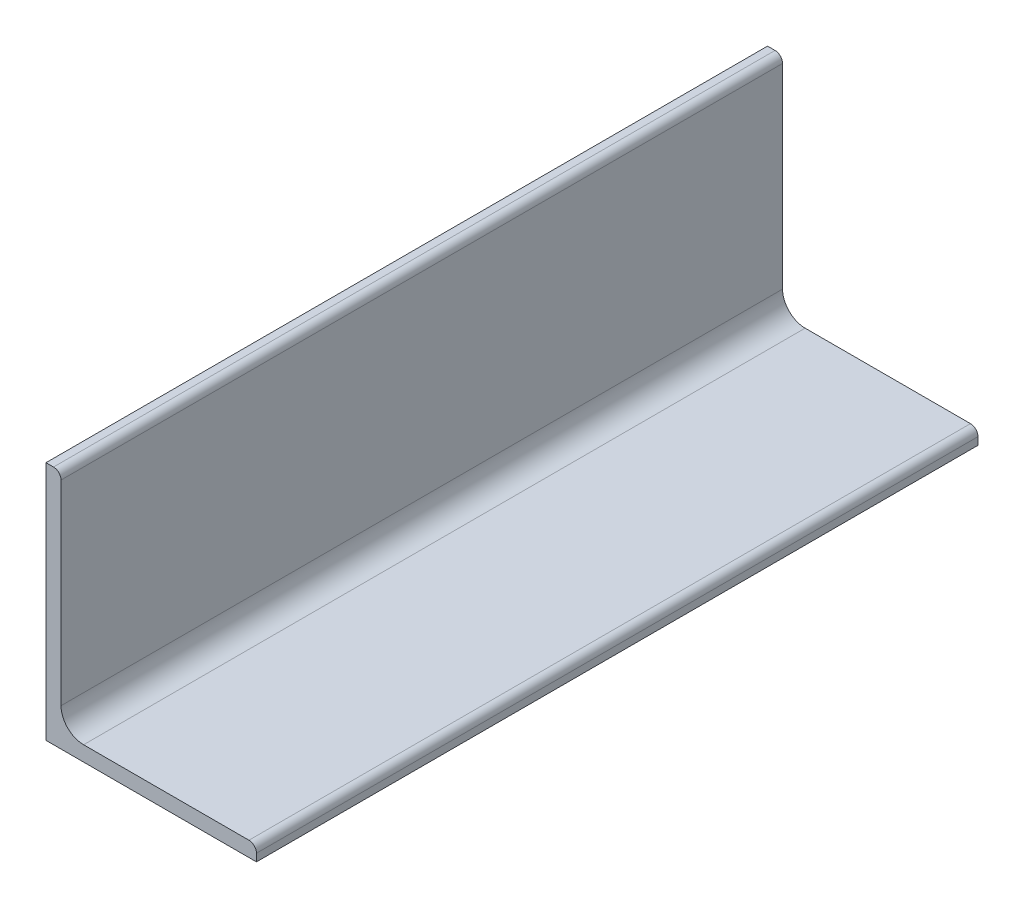
ISO-10303-21;
HEADER;
FILE_DESCRIPTION(('STEP AP214'),'2;1');
FILE_NAME('part.step','',(''),(''),'','','');
FILE_SCHEMA(('AUTOMOTIVE_DESIGN { 1 0 10303 214 1 1 1 1 }'));
ENDSEC;
DATA;
#1=APPLICATION_CONTEXT('core data for automotive mechanical design processes');
#2=APPLICATION_PROTOCOL_DEFINITION('international standard','automotive_design',2000,#1);
#3=PRODUCT_CONTEXT('',#1,'mechanical');
#4=PRODUCT('Part','Part','',(#3));
#5=PRODUCT_RELATED_PRODUCT_CATEGORY('part','',(#4));
#6=PRODUCT_DEFINITION_FORMATION('','',#4);
#7=PRODUCT_DEFINITION_CONTEXT('part definition',#1,'design');
#8=PRODUCT_DEFINITION('design','',#6,#7);
#9=PRODUCT_DEFINITION_SHAPE('','',#8);
#10=(LENGTH_UNIT() NAMED_UNIT(*) SI_UNIT(.MILLI.,.METRE.));
#11=(NAMED_UNIT(*) PLANE_ANGLE_UNIT() SI_UNIT($,.RADIAN.));
#12=(NAMED_UNIT(*) SI_UNIT($,.STERADIAN.) SOLID_ANGLE_UNIT());
#13=UNCERTAINTY_MEASURE_WITH_UNIT(LENGTH_MEASURE(1.E-05),#10,'distance_accuracy_value','');
#14=(GEOMETRIC_REPRESENTATION_CONTEXT(3) GLOBAL_UNCERTAINTY_ASSIGNED_CONTEXT((#13)) GLOBAL_UNIT_ASSIGNED_CONTEXT((#10,
#11,#12)) REPRESENTATION_CONTEXT('',''));
#15=CARTESIAN_POINT('',(0.,0.,0.));
#16=DIRECTION('',(0.,0.,1.));
#17=DIRECTION('',(1.,0.,0.));
#18=AXIS2_PLACEMENT_3D('',#15,#16,#17);
#19=CARTESIAN_POINT('',(0.0836264027816469,102.172018782971,304.8));
#20=DIRECTION('',(1.,0.,0.));
#21=DIRECTION('',(0.,0.,-1.));
#22=AXIS2_PLACEMENT_3D('',#19,#20,#21);
#23=PLANE('',#22);
#24=DIRECTION('',(0.,-1.,0.));
#25=VECTOR('',#24,1.);
#26=CARTESIAN_POINT('',(0.0836264027816469,102.172018782971,0.));
#27=LINE('',#26,#25);
#28=CARTESIAN_POINT('',(0.0836264027816469,102.172018782971,0.));
#29=VERTEX_POINT('',#28);
#30=CARTESIAN_POINT('',(0.0836264027816469,0.572018782971054,0.));
#31=VERTEX_POINT('',#30);
#32=EDGE_CURVE('E135',#29,#31,#27,.T.);
#33=ORIENTED_EDGE('',*,*,#32,.T.);
#34=DIRECTION('',(0.,0.,-1.));
#35=VECTOR('',#34,1.);
#36=CARTESIAN_POINT('',(0.0836264027816469,0.572018782971054,304.8));
#37=LINE('',#36,#35);
#38=CARTESIAN_POINT('',(0.0836264027816469,0.572018782971054,304.8));
#39=VERTEX_POINT('',#38);
#40=EDGE_CURVE('E11',#39,#31,#37,.T.);
#41=ORIENTED_EDGE('',*,*,#40,.F.);
#42=DIRECTION('',(0.,-1.,0.));
#43=VECTOR('',#42,1.);
#44=CARTESIAN_POINT('',(0.0836264027816469,102.172018782971,304.8));
#45=LINE('',#44,#43);
#46=CARTESIAN_POINT('',(0.0836264027816469,102.172018782971,304.8));
#47=VERTEX_POINT('',#46);
#48=EDGE_CURVE('E151',#47,#39,#45,.T.);
#49=ORIENTED_EDGE('',*,*,#48,.F.);
#50=DIRECTION('',(0.,0.,-1.));
#51=VECTOR('',#50,1.);
#52=CARTESIAN_POINT('',(0.0836264027816469,102.172018782971,304.8));
#53=LINE('',#52,#51);
#54=EDGE_CURVE('E131',#47,#29,#53,.T.);
#55=ORIENTED_EDGE('',*,*,#54,.T.);
#56=EDGE_LOOP('',(#33,#41,#49,#55));
#57=FACE_BOUND('',#56,.T.);
#58=ADVANCED_FACE('F33',(#57),#23,.F.);
#59=CARTESIAN_POINT('',(0.0836264027816469,0.572018782971054,304.8));
#60=DIRECTION('',(0.,1.,0.));
#61=DIRECTION('',(0.,0.,1.));
#62=AXIS2_PLACEMENT_3D('',#59,#60,#61);
#63=PLANE('',#62);
#64=DIRECTION('',(1.,0.,0.));
#65=VECTOR('',#64,1.);
#66=CARTESIAN_POINT('',(0.0836264027816469,0.572018782971054,0.));
#67=LINE('',#66,#65);
#68=CARTESIAN_POINT('',(88.9836264027817,0.572018782971054,0.));
#69=VERTEX_POINT('',#68);
#70=EDGE_CURVE('E138',#31,#69,#67,.T.);
#71=ORIENTED_EDGE('',*,*,#70,.T.);
#72=DIRECTION('',(0.,0.,-1.));
#73=VECTOR('',#72,1.);
#74=CARTESIAN_POINT('',(88.9836264027817,0.572018782971054,304.8));
#75=LINE('',#74,#73);
#76=CARTESIAN_POINT('',(88.9836264027817,0.572018782971054,304.8));
#77=VERTEX_POINT('',#76);
#78=EDGE_CURVE('E41',#77,#69,#75,.T.);
#79=ORIENTED_EDGE('',*,*,#78,.F.);
#80=DIRECTION('',(1.,0.,0.));
#81=VECTOR('',#80,1.);
#82=CARTESIAN_POINT('',(0.0836264027816469,0.572018782971054,304.8));
#83=LINE('',#82,#81);
#84=EDGE_CURVE('E95',#39,#77,#83,.T.);
#85=ORIENTED_EDGE('',*,*,#84,.F.);
#86=ORIENTED_EDGE('',*,*,#40,.T.);
#87=EDGE_LOOP('',(#71,#79,#85,#86));
#88=FACE_BOUND('',#87,.T.);
#89=ADVANCED_FACE('F194',(#88),#63,.F.);
#90=CARTESIAN_POINT('',(88.9836264027817,0.572018782971054,304.8));
#91=DIRECTION('',(-1.,0.,0.));
#92=DIRECTION('',(0.,0.,1.));
#93=AXIS2_PLACEMENT_3D('',#90,#91,#92);
#94=PLANE('',#93);
#95=DIRECTION('',(0.,1.,0.));
#96=VECTOR('',#95,1.);
#97=CARTESIAN_POINT('',(88.9836264027817,0.572018782971054,0.));
#98=LINE('',#97,#96);
#99=CARTESIAN_POINT('',(88.9836264027817,3.74701878297105,0.));
#100=VERTEX_POINT('',#99);
#101=EDGE_CURVE('E140',#69,#100,#98,.T.);
#102=ORIENTED_EDGE('',*,*,#101,.T.);
#103=DIRECTION('',(0.,0.,-1.));
#104=VECTOR('',#103,1.);
#105=CARTESIAN_POINT('',(88.9836264027817,3.74701878297105,304.8));
#106=LINE('',#105,#104);
#107=CARTESIAN_POINT('',(88.9836264027817,3.74701878297105,304.8));
#108=VERTEX_POINT('',#107);
#109=EDGE_CURVE('E161',#108,#100,#106,.T.);
#110=ORIENTED_EDGE('',*,*,#109,.F.);
#111=DIRECTION('',(0.,1.,0.));
#112=VECTOR('',#111,1.);
#113=CARTESIAN_POINT('',(88.9836264027817,0.572018782971054,304.8));
#114=LINE('',#113,#112);
#115=EDGE_CURVE('E169',#77,#108,#114,.T.);
#116=ORIENTED_EDGE('',*,*,#115,.F.);
#117=ORIENTED_EDGE('',*,*,#78,.T.);
#118=EDGE_LOOP('',(#102,#110,#116,#117));
#119=FACE_BOUND('',#118,.T.);
#120=ADVANCED_FACE('F167',(#119),#94,.F.);
#121=CARTESIAN_POINT('',(85.8086264027816,3.74701878297105,304.8));
#122=DIRECTION('',(0.,0.,-1.));
#123=DIRECTION('',(-1.,0.,0.));
#124=AXIS2_PLACEMENT_3D('',#121,#122,#123);
#125=CYLINDRICAL_SURFACE('',#124,3.17500000000001);
#126=CARTESIAN_POINT('',(85.8086264027816,3.74701878297105,0.));
#127=DIRECTION('',(0.,0.,1.));
#128=DIRECTION('',(1.,0.,0.));
#129=AXIS2_PLACEMENT_3D('',#126,#127,#128);
#130=CIRCLE('',#129,3.17500000000001);
#131=CARTESIAN_POINT('',(85.8086264027816,6.92201878297106,0.));
#132=VERTEX_POINT('',#131);
#133=EDGE_CURVE('E142',#100,#132,#130,.T.);
#134=ORIENTED_EDGE('',*,*,#133,.T.);
#135=DIRECTION('',(0.,0.,-1.));
#136=VECTOR('',#135,1.);
#137=CARTESIAN_POINT('',(85.8086264027816,6.92201878297106,304.8));
#138=LINE('',#137,#136);
#139=CARTESIAN_POINT('',(85.8086264027816,6.92201878297106,304.8));
#140=VERTEX_POINT('',#139);
#141=EDGE_CURVE('E158',#140,#132,#138,.T.);
#142=ORIENTED_EDGE('',*,*,#141,.F.);
#143=CARTESIAN_POINT('',(85.8086264027816,3.74701878297105,304.8));
#144=DIRECTION('',(0.,0.,1.));
#145=DIRECTION('',(1.,0.,0.));
#146=AXIS2_PLACEMENT_3D('',#143,#144,#145);
#147=CIRCLE('',#146,3.17500000000001);
#148=EDGE_CURVE('E185',#108,#140,#147,.T.);
#149=ORIENTED_EDGE('',*,*,#148,.F.);
#150=ORIENTED_EDGE('',*,*,#109,.T.);
#151=EDGE_LOOP('',(#134,#142,#149,#150));
#152=FACE_BOUND('',#151,.T.);
#153=ADVANCED_FACE('F178',(#152),#125,.T.);
#154=CARTESIAN_POINT('',(85.8086264027816,6.92201878297105,304.8));
#155=DIRECTION('',(0.,-1.,0.));
#156=DIRECTION('',(0.,0.,-1.));
#157=AXIS2_PLACEMENT_3D('',#154,#155,#156);
#158=PLANE('',#157);
#159=DIRECTION('',(-1.,0.,0.));
#160=VECTOR('',#159,1.);
#161=CARTESIAN_POINT('',(85.8086264027816,6.92201878297105,0.));
#162=LINE('',#161,#160);
#163=CARTESIAN_POINT('',(15.9586264027816,6.92201878297105,0.));
#164=VERTEX_POINT('',#163);
#165=EDGE_CURVE('E144',#132,#164,#162,.T.);
#166=ORIENTED_EDGE('',*,*,#165,.T.);
#167=DIRECTION('',(0.,0.,-1.));
#168=VECTOR('',#167,1.);
#169=CARTESIAN_POINT('',(15.9586264027816,6.92201878297105,304.8));
#170=LINE('',#169,#168);
#171=CARTESIAN_POINT('',(15.9586264027816,6.92201878297105,304.8));
#172=VERTEX_POINT('',#171);
#173=EDGE_CURVE('E155',#172,#164,#170,.T.);
#174=ORIENTED_EDGE('',*,*,#173,.F.);
#175=DIRECTION('',(-1.,0.,0.));
#176=VECTOR('',#175,1.);
#177=CARTESIAN_POINT('',(85.8086264027816,6.92201878297105,304.8));
#178=LINE('',#177,#176);
#179=EDGE_CURVE('E184',#140,#172,#178,.T.);
#180=ORIENTED_EDGE('',*,*,#179,.F.);
#181=ORIENTED_EDGE('',*,*,#141,.T.);
#182=EDGE_LOOP('',(#166,#174,#180,#181));
#183=FACE_BOUND('',#182,.T.);
#184=ADVANCED_FACE('F182',(#183),#158,.F.);
#185=CARTESIAN_POINT('',(15.9586264027816,16.447018782971,304.8));
#186=DIRECTION('',(0.,0.,-1.));
#187=DIRECTION('',(-1.,0.,0.));
#188=AXIS2_PLACEMENT_3D('',#185,#186,#187);
#189=CYLINDRICAL_SURFACE('',#188,9.52499999999999);
#190=CARTESIAN_POINT('',(15.9586264027816,16.447018782971,0.));
#191=DIRECTION('',(0.,0.,-1.));
#192=DIRECTION('',(1.,0.,0.));
#193=AXIS2_PLACEMENT_3D('',#190,#191,#192);
#194=CIRCLE('',#193,9.52499999999999);
#195=CARTESIAN_POINT('',(6.43362640278165,16.4470187829711,0.));
#196=VERTEX_POINT('',#195);
#197=EDGE_CURVE('E146',#164,#196,#194,.T.);
#198=ORIENTED_EDGE('',*,*,#197,.T.);
#199=DIRECTION('',(0.,0.,-1.));
#200=VECTOR('',#199,1.);
#201=CARTESIAN_POINT('',(6.43362640278165,16.4470187829711,304.8));
#202=LINE('',#201,#200);
#203=CARTESIAN_POINT('',(6.43362640278165,16.4470187829711,304.8));
#204=VERTEX_POINT('',#203);
#205=EDGE_CURVE('E126',#204,#196,#202,.T.);
#206=ORIENTED_EDGE('',*,*,#205,.F.);
#207=CARTESIAN_POINT('',(15.9586264027816,16.447018782971,304.8));
#208=DIRECTION('',(0.,0.,-1.));
#209=DIRECTION('',(1.,0.,0.));
#210=AXIS2_PLACEMENT_3D('',#207,#208,#209);
#211=CIRCLE('',#210,9.52499999999999);
#212=EDGE_CURVE('E117',#172,#204,#211,.T.);
#213=ORIENTED_EDGE('',*,*,#212,.F.);
#214=ORIENTED_EDGE('',*,*,#173,.T.);
#215=EDGE_LOOP('',(#198,#206,#213,#214));
#216=FACE_BOUND('',#215,.T.);
#217=ADVANCED_FACE('F206',(#216),#189,.F.);
#218=CARTESIAN_POINT('',(6.43362640278165,16.4470187829711,304.8));
#219=DIRECTION('',(-1.,0.,0.));
#220=DIRECTION('',(0.,0.,1.));
#221=AXIS2_PLACEMENT_3D('',#218,#219,#220);
#222=PLANE('',#221);
#223=DIRECTION('',(0.,1.,0.));
#224=VECTOR('',#223,1.);
#225=CARTESIAN_POINT('',(6.43362640278165,16.4470187829711,0.));
#226=LINE('',#225,#224);
#227=CARTESIAN_POINT('',(6.43362640278165,98.9970187829711,0.));
#228=VERTEX_POINT('',#227);
#229=EDGE_CURVE('E125',#196,#228,#226,.T.);
#230=ORIENTED_EDGE('',*,*,#229,.T.);
#231=DIRECTION('',(0.,0.,-1.));
#232=VECTOR('',#231,1.);
#233=CARTESIAN_POINT('',(6.43362640278165,98.9970187829711,304.8));
#234=LINE('',#233,#232);
#235=CARTESIAN_POINT('',(6.43362640278165,98.9970187829711,304.8));
#236=VERTEX_POINT('',#235);
#237=EDGE_CURVE('E122',#236,#228,#234,.T.);
#238=ORIENTED_EDGE('',*,*,#237,.F.);
#239=DIRECTION('',(0.,1.,0.));
#240=VECTOR('',#239,1.);
#241=CARTESIAN_POINT('',(6.43362640278165,16.4470187829711,304.8));
#242=LINE('',#241,#240);
#243=EDGE_CURVE('E111',#204,#236,#242,.T.);
#244=ORIENTED_EDGE('',*,*,#243,.F.);
#245=ORIENTED_EDGE('',*,*,#205,.T.);
#246=EDGE_LOOP('',(#230,#238,#244,#245));
#247=FACE_BOUND('',#246,.T.);
#248=ADVANCED_FACE('F123',(#247),#222,.F.);
#249=CARTESIAN_POINT('',(3.25862640278165,98.997018782971,304.8));
#250=DIRECTION('',(0.,0.,-1.));
#251=DIRECTION('',(-1.,0.,0.));
#252=AXIS2_PLACEMENT_3D('',#249,#250,#251);
#253=CYLINDRICAL_SURFACE('',#252,3.175);
#254=CARTESIAN_POINT('',(3.25862640278165,98.997018782971,0.));
#255=DIRECTION('',(0.,0.,1.));
#256=DIRECTION('',(1.,0.,0.));
#257=AXIS2_PLACEMENT_3D('',#254,#255,#256);
#258=CIRCLE('',#257,3.175);
#259=CARTESIAN_POINT('',(3.25862640278165,102.172018782971,0.));
#260=VERTEX_POINT('',#259);
#261=EDGE_CURVE('E81',#228,#260,#258,.T.);
#262=ORIENTED_EDGE('',*,*,#261,.T.);
#263=DIRECTION('',(0.,0.,-1.));
#264=VECTOR('',#263,1.);
#265=CARTESIAN_POINT('',(3.25862640278165,102.172018782971,304.8));
#266=LINE('',#265,#264);
#267=CARTESIAN_POINT('',(3.25862640278165,102.172018782971,304.8));
#268=VERTEX_POINT('',#267);
#269=EDGE_CURVE('E127',#268,#260,#266,.T.);
#270=ORIENTED_EDGE('',*,*,#269,.F.);
#271=CARTESIAN_POINT('',(3.25862640278165,98.997018782971,304.8));
#272=DIRECTION('',(0.,0.,1.));
#273=DIRECTION('',(1.,0.,0.));
#274=AXIS2_PLACEMENT_3D('',#271,#272,#273);
#275=CIRCLE('',#274,3.175);
#276=EDGE_CURVE('E115',#236,#268,#275,.T.);
#277=ORIENTED_EDGE('',*,*,#276,.F.);
#278=ORIENTED_EDGE('',*,*,#237,.T.);
#279=EDGE_LOOP('',(#262,#270,#277,#278));
#280=FACE_BOUND('',#279,.T.);
#281=ADVANCED_FACE('F129',(#280),#253,.T.);
#282=CARTESIAN_POINT('',(3.25862640278165,102.172018782971,304.8));
#283=DIRECTION('',(0.,-1.,0.));
#284=DIRECTION('',(0.,0.,-1.));
#285=AXIS2_PLACEMENT_3D('',#282,#283,#284);
#286=PLANE('',#285);
#287=DIRECTION('',(-1.,0.,0.));
#288=VECTOR('',#287,1.);
#289=CARTESIAN_POINT('',(3.25862640278165,102.172018782971,0.));
#290=LINE('',#289,#288);
#291=EDGE_CURVE('E87',#260,#29,#290,.T.);
#292=ORIENTED_EDGE('',*,*,#291,.T.);
#293=ORIENTED_EDGE('',*,*,#54,.F.);
#294=DIRECTION('',(-1.,0.,0.));
#295=VECTOR('',#294,1.);
#296=CARTESIAN_POINT('',(3.25862640278165,102.172018782971,304.8));
#297=LINE('',#296,#295);
#298=EDGE_CURVE('E49',#268,#47,#297,.T.);
#299=ORIENTED_EDGE('',*,*,#298,.F.);
#300=ORIENTED_EDGE('',*,*,#269,.T.);
#301=EDGE_LOOP('',(#292,#293,#299,#300));
#302=FACE_BOUND('',#301,.T.);
#303=ADVANCED_FACE('F214',(#302),#286,.F.);
#304=CARTESIAN_POINT('',(85.8086264027816,3.74701878297105,304.8));
#305=DIRECTION('',(0.,0.,1.));
#306=DIRECTION('',(1.,0.,0.));
#307=AXIS2_PLACEMENT_3D('',#304,#305,#306);
#308=PLANE('',#307);
#309=ORIENTED_EDGE('',*,*,#48,.T.);
#310=ORIENTED_EDGE('',*,*,#84,.T.);
#311=ORIENTED_EDGE('',*,*,#115,.T.);
#312=ORIENTED_EDGE('',*,*,#148,.T.);
#313=ORIENTED_EDGE('',*,*,#179,.T.);
#314=ORIENTED_EDGE('',*,*,#212,.T.);
#315=ORIENTED_EDGE('',*,*,#243,.T.);
#316=ORIENTED_EDGE('',*,*,#276,.T.);
#317=ORIENTED_EDGE('',*,*,#298,.T.);
#318=EDGE_LOOP('',(#309,#310,#311,#312,#313,#314,#315,#316,#317));
#319=FACE_BOUND('',#318,.T.);
#320=ADVANCED_FACE('F113',(#319),#308,.T.);
#321=CARTESIAN_POINT('',(85.8086264027816,3.74701878297105,0.));
#322=DIRECTION('',(0.,0.,1.));
#323=DIRECTION('',(1.,0.,0.));
#324=AXIS2_PLACEMENT_3D('',#321,#322,#323);
#325=PLANE('',#324);
#326=ORIENTED_EDGE('',*,*,#32,.F.);
#327=ORIENTED_EDGE('',*,*,#291,.F.);
#328=ORIENTED_EDGE('',*,*,#261,.F.);
#329=ORIENTED_EDGE('',*,*,#229,.F.);
#330=ORIENTED_EDGE('',*,*,#197,.F.);
#331=ORIENTED_EDGE('',*,*,#165,.F.);
#332=ORIENTED_EDGE('',*,*,#133,.F.);
#333=ORIENTED_EDGE('',*,*,#101,.F.);
#334=ORIENTED_EDGE('',*,*,#70,.F.);
#335=EDGE_LOOP('',(#326,#327,#328,#329,#330,#331,#332,#333,#334));
#336=FACE_BOUND('',#335,.T.);
#337=ADVANCED_FACE('F173',(#336),#325,.F.);
#338=CLOSED_SHELL('',(#58,#89,#120,#153,#184,#217,#248,#281,#303,#320,#337));
#339=MANIFOLD_SOLID_BREP('B2',#338);
#340=ADVANCED_BREP_SHAPE_REPRESENTATION('',(#18,#339),#14);
#341=SHAPE_DEFINITION_REPRESENTATION(#9,#340);
ENDSEC;
END-ISO-10303-21;
